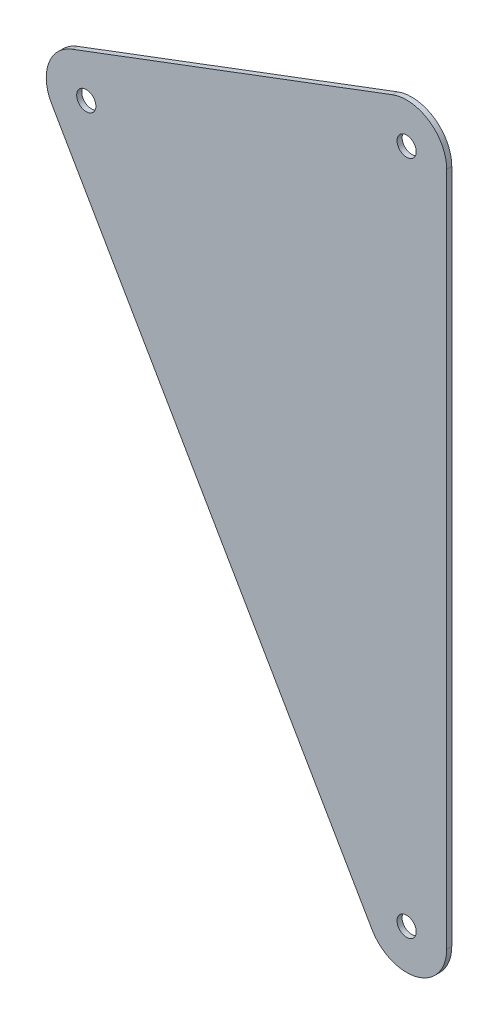
ISO-10303-21;
HEADER;
FILE_DESCRIPTION(('STEP AP214'),'2;1');
FILE_NAME('part.step','',(''),(''),'','','');
FILE_SCHEMA(('AUTOMOTIVE_DESIGN { 1 0 10303 214 1 1 1 1 }'));
ENDSEC;
DATA;
#1=APPLICATION_CONTEXT('core data for automotive mechanical design processes');
#2=APPLICATION_PROTOCOL_DEFINITION('international standard','automotive_design',2000,#1);
#3=PRODUCT_CONTEXT('',#1,'mechanical');
#4=PRODUCT('Part','Part','',(#3));
#5=PRODUCT_RELATED_PRODUCT_CATEGORY('part','',(#4));
#6=PRODUCT_DEFINITION_FORMATION('','',#4);
#7=PRODUCT_DEFINITION_CONTEXT('part definition',#1,'design');
#8=PRODUCT_DEFINITION('design','',#6,#7);
#9=PRODUCT_DEFINITION_SHAPE('','',#8);
#10=(LENGTH_UNIT() NAMED_UNIT(*) SI_UNIT(.MILLI.,.METRE.));
#11=(NAMED_UNIT(*) PLANE_ANGLE_UNIT() SI_UNIT($,.RADIAN.));
#12=(NAMED_UNIT(*) SI_UNIT($,.STERADIAN.) SOLID_ANGLE_UNIT());
#13=UNCERTAINTY_MEASURE_WITH_UNIT(LENGTH_MEASURE(1.E-05),#10,'distance_accuracy_value','');
#14=(GEOMETRIC_REPRESENTATION_CONTEXT(3) GLOBAL_UNCERTAINTY_ASSIGNED_CONTEXT((#13)) GLOBAL_UNIT_ASSIGNED_CONTEXT((#10,
#11,#12)) REPRESENTATION_CONTEXT('',''));
#15=CARTESIAN_POINT('',(0.,0.,0.));
#16=DIRECTION('',(0.,0.,1.));
#17=DIRECTION('',(1.,0.,0.));
#18=AXIS2_PLACEMENT_3D('',#15,#16,#17);
#19=CARTESIAN_POINT('',(0.,0.,1.5875));
#20=DIRECTION('',(0.,0.,1.));
#21=DIRECTION('',(1.,0.,0.));
#22=AXIS2_PLACEMENT_3D('',#19,#20,#21);
#23=PLANE('',#22);
#24=CARTESIAN_POINT('',(0.,210.889668604405,1.5875));
#25=DIRECTION('',(0.,0.,1.));
#26=DIRECTION('',(1.,0.,0.));
#27=AXIS2_PLACEMENT_3D('',#24,#25,#26);
#28=CIRCLE('',#27,3.);
#29=CARTESIAN_POINT('',(3.,210.889668604405,1.5875));
#30=VERTEX_POINT('',#29);
#31=EDGE_CURVE('E183',#30,#30,#28,.T.);
#32=ORIENTED_EDGE('',*,*,#31,.F.);
#33=EDGE_LOOP('',(#32));
#34=FACE_BOUND('',#33,.T.);
#35=CARTESIAN_POINT('',(0.,0.,1.5875));
#36=DIRECTION('',(0.,0.,1.));
#37=DIRECTION('',(1.,0.,0.));
#38=AXIS2_PLACEMENT_3D('',#35,#36,#37);
#39=CIRCLE('',#38,12.5);
#40=CARTESIAN_POINT('',(-10.8253175473055,-6.24999999999999,1.5875));
#41=VERTEX_POINT('',#40);
#42=CARTESIAN_POINT('',(12.5,0.,1.5875));
#43=VERTEX_POINT('',#42);
#44=EDGE_CURVE('E128',#41,#43,#39,.T.);
#45=ORIENTED_EDGE('',*,*,#44,.T.);
#46=DIRECTION('',(0.,1.,0.));
#47=VECTOR('',#46,1.);
#48=CARTESIAN_POINT('',(12.5,0.,1.5875));
#49=LINE('',#48,#47);
#50=CARTESIAN_POINT('',(12.5,210.889668604405,1.5875));
#51=VERTEX_POINT('',#50);
#52=EDGE_CURVE('E86',#43,#51,#49,.T.);
#53=ORIENTED_EDGE('',*,*,#52,.T.);
#54=CARTESIAN_POINT('',(0.,210.889668604405,1.5875));
#55=DIRECTION('',(0.,0.,1.));
#56=DIRECTION('',(1.,0.,0.));
#57=AXIS2_PLACEMENT_3D('',#54,#55,#56);
#58=CIRCLE('',#57,12.5);
#59=CARTESIAN_POINT('',(-4.40796658783525,222.586669526032,1.5875));
#60=VERTEX_POINT('',#59);
#61=EDGE_CURVE('E99',#51,#60,#58,.T.);
#62=ORIENTED_EDGE('',*,*,#61,.T.);
#63=DIRECTION('',(-0.935760073730109,-0.352637327026819,0.));
#64=VECTOR('',#63,1.);
#65=CARTESIAN_POINT('',(-4.40796658783525,222.586669526032,1.5875));
#66=LINE('',#65,#64);
#67=CARTESIAN_POINT('',(-104.407966587835,184.902081678514,1.5875));
#68=VERTEX_POINT('',#67);
#69=EDGE_CURVE('E93',#60,#68,#66,.T.);
#70=ORIENTED_EDGE('',*,*,#69,.T.);
#71=CARTESIAN_POINT('',(-100.,173.205080756888,1.5875));
#72=DIRECTION('',(0.,0.,1.));
#73=DIRECTION('',(1.,0.,0.));
#74=AXIS2_PLACEMENT_3D('',#71,#72,#73);
#75=CIRCLE('',#74,12.4999999999999);
#76=CARTESIAN_POINT('',(-110.825317547305,166.955080756888,1.5875));
#77=VERTEX_POINT('',#76);
#78=EDGE_CURVE('E97',#68,#77,#75,.T.);
#79=ORIENTED_EDGE('',*,*,#78,.T.);
#80=DIRECTION('',(0.5,-0.866025403784439,0.));
#81=VECTOR('',#80,1.);
#82=CARTESIAN_POINT('',(-110.825317547305,166.955080756888,1.5875));
#83=LINE('',#82,#81);
#84=EDGE_CURVE('E49',#77,#41,#83,.T.);
#85=ORIENTED_EDGE('',*,*,#84,.T.);
#86=EDGE_LOOP('',(#45,#53,#62,#70,#79,#85));
#87=FACE_BOUND('',#86,.T.);
#88=CARTESIAN_POINT('',(-100.,173.205080756888,1.5875));
#89=DIRECTION('',(0.,0.,1.));
#90=DIRECTION('',(1.,0.,0.));
#91=AXIS2_PLACEMENT_3D('',#88,#89,#90);
#92=CIRCLE('',#91,2.99999999999999);
#93=CARTESIAN_POINT('',(-97.,173.205080756888,1.5875));
#94=VERTEX_POINT('',#93);
#95=EDGE_CURVE('E121',#94,#94,#92,.T.);
#96=ORIENTED_EDGE('',*,*,#95,.F.);
#97=EDGE_LOOP('',(#96));
#98=FACE_BOUND('',#97,.T.);
#99=CARTESIAN_POINT('',(0.,0.,1.5875));
#100=DIRECTION('',(0.,0.,1.));
#101=DIRECTION('',(1.,0.,0.));
#102=AXIS2_PLACEMENT_3D('',#99,#100,#101);
#103=CIRCLE('',#102,3.);
#104=CARTESIAN_POINT('',(3.,0.,1.5875));
#105=VERTEX_POINT('',#104);
#106=EDGE_CURVE('E174',#105,#105,#103,.T.);
#107=ORIENTED_EDGE('',*,*,#106,.F.);
#108=EDGE_LOOP('',(#107));
#109=FACE_BOUND('',#108,.T.);
#110=ADVANCED_FACE('F32',(#34,#87,#98,#109),#23,.T.);
#111=CARTESIAN_POINT('',(0.,0.,0.));
#112=DIRECTION('',(0.,0.,1.));
#113=DIRECTION('',(1.,0.,0.));
#114=AXIS2_PLACEMENT_3D('',#111,#112,#113);
#115=PLANE('',#114);
#116=CARTESIAN_POINT('',(0.,0.,0.));
#117=DIRECTION('',(0.,0.,1.));
#118=DIRECTION('',(1.,0.,0.));
#119=AXIS2_PLACEMENT_3D('',#116,#117,#118);
#120=CIRCLE('',#119,12.5);
#121=CARTESIAN_POINT('',(-10.8253175473055,-6.24999999999999,0.));
#122=VERTEX_POINT('',#121);
#123=CARTESIAN_POINT('',(12.5,0.,0.));
#124=VERTEX_POINT('',#123);
#125=EDGE_CURVE('E117',#122,#124,#120,.T.);
#126=ORIENTED_EDGE('',*,*,#125,.F.);
#127=DIRECTION('',(0.5,-0.866025403784439,0.));
#128=VECTOR('',#127,1.);
#129=CARTESIAN_POINT('',(-110.825317547305,166.955080756888,0.));
#130=LINE('',#129,#128);
#131=CARTESIAN_POINT('',(-110.825317547305,166.955080756888,0.));
#132=VERTEX_POINT('',#131);
#133=EDGE_CURVE('E78',#132,#122,#130,.T.);
#134=ORIENTED_EDGE('',*,*,#133,.F.);
#135=CARTESIAN_POINT('',(-100.,173.205080756888,0.));
#136=DIRECTION('',(0.,0.,1.));
#137=DIRECTION('',(1.,0.,0.));
#138=AXIS2_PLACEMENT_3D('',#135,#136,#137);
#139=CIRCLE('',#138,12.4999999999999);
#140=CARTESIAN_POINT('',(-104.407966587835,184.902081678514,0.));
#141=VERTEX_POINT('',#140);
#142=EDGE_CURVE('E72',#141,#132,#139,.T.);
#143=ORIENTED_EDGE('',*,*,#142,.F.);
#144=DIRECTION('',(-0.935760073730109,-0.352637327026819,0.));
#145=VECTOR('',#144,1.);
#146=CARTESIAN_POINT('',(-4.40796658783525,222.586669526032,0.));
#147=LINE('',#146,#145);
#148=CARTESIAN_POINT('',(-4.40796658783525,222.586669526032,0.));
#149=VERTEX_POINT('',#148);
#150=EDGE_CURVE('E107',#149,#141,#147,.T.);
#151=ORIENTED_EDGE('',*,*,#150,.F.);
#152=CARTESIAN_POINT('',(0.,210.889668604405,0.));
#153=DIRECTION('',(0.,0.,1.));
#154=DIRECTION('',(1.,0.,0.));
#155=AXIS2_PLACEMENT_3D('',#152,#153,#154);
#156=CIRCLE('',#155,12.5);
#157=CARTESIAN_POINT('',(12.5,210.889668604405,0.));
#158=VERTEX_POINT('',#157);
#159=EDGE_CURVE('E123',#158,#149,#156,.T.);
#160=ORIENTED_EDGE('',*,*,#159,.F.);
#161=DIRECTION('',(0.,1.,0.));
#162=VECTOR('',#161,1.);
#163=CARTESIAN_POINT('',(12.5,0.,0.));
#164=LINE('',#163,#162);
#165=EDGE_CURVE('E120',#124,#158,#164,.T.);
#166=ORIENTED_EDGE('',*,*,#165,.F.);
#167=EDGE_LOOP('',(#126,#134,#143,#151,#160,#166));
#168=FACE_BOUND('',#167,.T.);
#169=CARTESIAN_POINT('',(-100.,173.205080756888,0.));
#170=DIRECTION('',(0.,0.,1.));
#171=DIRECTION('',(1.,0.,0.));
#172=AXIS2_PLACEMENT_3D('',#169,#170,#171);
#173=CIRCLE('',#172,2.99999999999999);
#174=CARTESIAN_POINT('',(-97.,173.205080756888,0.));
#175=VERTEX_POINT('',#174);
#176=EDGE_CURVE('E186',#175,#175,#173,.T.);
#177=ORIENTED_EDGE('',*,*,#176,.T.);
#178=EDGE_LOOP('',(#177));
#179=FACE_BOUND('',#178,.T.);
#180=CARTESIAN_POINT('',(0.,210.889668604405,0.));
#181=DIRECTION('',(0.,0.,1.));
#182=DIRECTION('',(1.,0.,0.));
#183=AXIS2_PLACEMENT_3D('',#180,#181,#182);
#184=CIRCLE('',#183,3.);
#185=CARTESIAN_POINT('',(3.,210.889668604405,0.));
#186=VERTEX_POINT('',#185);
#187=EDGE_CURVE('E180',#186,#186,#184,.T.);
#188=ORIENTED_EDGE('',*,*,#187,.T.);
#189=EDGE_LOOP('',(#188));
#190=FACE_BOUND('',#189,.T.);
#191=CARTESIAN_POINT('',(0.,0.,0.));
#192=DIRECTION('',(0.,0.,1.));
#193=DIRECTION('',(1.,0.,0.));
#194=AXIS2_PLACEMENT_3D('',#191,#192,#193);
#195=CIRCLE('',#194,3.);
#196=CARTESIAN_POINT('',(3.,0.,0.));
#197=VERTEX_POINT('',#196);
#198=EDGE_CURVE('E177',#197,#197,#195,.T.);
#199=ORIENTED_EDGE('',*,*,#198,.T.);
#200=EDGE_LOOP('',(#199));
#201=FACE_BOUND('',#200,.T.);
#202=ADVANCED_FACE('F137',(#168,#179,#190,#201),#115,.F.);
#203=CARTESIAN_POINT('',(0.,0.,1.5875));
#204=DIRECTION('',(0.,0.,-1.));
#205=DIRECTION('',(-1.,0.,0.));
#206=AXIS2_PLACEMENT_3D('',#203,#204,#205);
#207=CYLINDRICAL_SURFACE('',#206,12.5);
#208=ORIENTED_EDGE('',*,*,#125,.T.);
#209=DIRECTION('',(0.,0.,-1.));
#210=VECTOR('',#209,1.);
#211=CARTESIAN_POINT('',(12.5,0.,1.5875));
#212=LINE('',#211,#210);
#213=EDGE_CURVE('E11',#43,#124,#212,.T.);
#214=ORIENTED_EDGE('',*,*,#213,.F.);
#215=ORIENTED_EDGE('',*,*,#44,.F.);
#216=DIRECTION('',(0.,0.,-1.));
#217=VECTOR('',#216,1.);
#218=CARTESIAN_POINT('',(-10.8253175473055,-6.24999999999999,1.5875));
#219=LINE('',#218,#217);
#220=EDGE_CURVE('E113',#41,#122,#219,.T.);
#221=ORIENTED_EDGE('',*,*,#220,.T.);
#222=EDGE_LOOP('',(#208,#214,#215,#221));
#223=FACE_BOUND('',#222,.T.);
#224=ADVANCED_FACE('F34',(#223),#207,.T.);
#225=CARTESIAN_POINT('',(12.5,0.,1.5875));
#226=DIRECTION('',(-1.,0.,0.));
#227=DIRECTION('',(0.,-1.,0.));
#228=AXIS2_PLACEMENT_3D('',#225,#226,#227);
#229=PLANE('',#228);
#230=ORIENTED_EDGE('',*,*,#165,.T.);
#231=DIRECTION('',(0.,0.,-1.));
#232=VECTOR('',#231,1.);
#233=CARTESIAN_POINT('',(12.5,210.889668604405,1.5875));
#234=LINE('',#233,#232);
#235=EDGE_CURVE('E41',#51,#158,#234,.T.);
#236=ORIENTED_EDGE('',*,*,#235,.F.);
#237=ORIENTED_EDGE('',*,*,#52,.F.);
#238=ORIENTED_EDGE('',*,*,#213,.T.);
#239=EDGE_LOOP('',(#230,#236,#237,#238));
#240=FACE_BOUND('',#239,.T.);
#241=ADVANCED_FACE('F236',(#240),#229,.F.);
#242=CARTESIAN_POINT('',(0.,210.889668604405,1.5875));
#243=DIRECTION('',(0.,0.,-1.));
#244=DIRECTION('',(-1.,0.,0.));
#245=AXIS2_PLACEMENT_3D('',#242,#243,#244);
#246=CYLINDRICAL_SURFACE('',#245,12.5);
#247=ORIENTED_EDGE('',*,*,#159,.T.);
#248=DIRECTION('',(0.,0.,-1.));
#249=VECTOR('',#248,1.);
#250=CARTESIAN_POINT('',(-4.40796658783525,222.586669526032,1.5875));
#251=LINE('',#250,#249);
#252=EDGE_CURVE('E108',#60,#149,#251,.T.);
#253=ORIENTED_EDGE('',*,*,#252,.F.);
#254=ORIENTED_EDGE('',*,*,#61,.F.);
#255=ORIENTED_EDGE('',*,*,#235,.T.);
#256=EDGE_LOOP('',(#247,#253,#254,#255));
#257=FACE_BOUND('',#256,.T.);
#258=ADVANCED_FACE('F134',(#257),#246,.T.);
#259=CARTESIAN_POINT('',(-4.40796658783525,222.586669526032,1.5875));
#260=DIRECTION('',(0.352637327026819,-0.935760073730109,0.));
#261=DIRECTION('',(0.935760073730109,0.352637327026819,0.));
#262=AXIS2_PLACEMENT_3D('',#259,#260,#261);
#263=PLANE('',#262);
#264=ORIENTED_EDGE('',*,*,#150,.T.);
#265=DIRECTION('',(0.,0.,-1.));
#266=VECTOR('',#265,1.);
#267=CARTESIAN_POINT('',(-104.407966587835,184.902081678514,1.5875));
#268=LINE('',#267,#266);
#269=EDGE_CURVE('E104',#68,#141,#268,.T.);
#270=ORIENTED_EDGE('',*,*,#269,.F.);
#271=ORIENTED_EDGE('',*,*,#69,.F.);
#272=ORIENTED_EDGE('',*,*,#252,.T.);
#273=EDGE_LOOP('',(#264,#270,#271,#272));
#274=FACE_BOUND('',#273,.T.);
#275=ADVANCED_FACE('F105',(#274),#263,.F.);
#276=CARTESIAN_POINT('',(-100.,173.205080756888,1.5875));
#277=DIRECTION('',(0.,0.,-1.));
#278=DIRECTION('',(-1.,0.,0.));
#279=AXIS2_PLACEMENT_3D('',#276,#277,#278);
#280=CYLINDRICAL_SURFACE('',#279,12.4999999999999);
#281=ORIENTED_EDGE('',*,*,#142,.T.);
#282=DIRECTION('',(0.,0.,-1.));
#283=VECTOR('',#282,1.);
#284=CARTESIAN_POINT('',(-110.825317547305,166.955080756888,1.5875));
#285=LINE('',#284,#283);
#286=EDGE_CURVE('E109',#77,#132,#285,.T.);
#287=ORIENTED_EDGE('',*,*,#286,.F.);
#288=ORIENTED_EDGE('',*,*,#78,.F.);
#289=ORIENTED_EDGE('',*,*,#269,.T.);
#290=EDGE_LOOP('',(#281,#287,#288,#289));
#291=FACE_BOUND('',#290,.T.);
#292=ADVANCED_FACE('F111',(#291),#280,.T.);
#293=CARTESIAN_POINT('',(-110.825317547305,166.955080756888,1.5875));
#294=DIRECTION('',(0.866025403784439,0.5,0.));
#295=DIRECTION('',(-0.5,0.866025403784439,0.));
#296=AXIS2_PLACEMENT_3D('',#293,#294,#295);
#297=PLANE('',#296);
#298=ORIENTED_EDGE('',*,*,#133,.T.);
#299=ORIENTED_EDGE('',*,*,#220,.F.);
#300=ORIENTED_EDGE('',*,*,#84,.F.);
#301=ORIENTED_EDGE('',*,*,#286,.T.);
#302=EDGE_LOOP('',(#298,#299,#300,#301));
#303=FACE_BOUND('',#302,.T.);
#304=ADVANCED_FACE('F142',(#303),#297,.F.);
#305=CARTESIAN_POINT('',(-100.,173.205080756888,1.5875));
#306=DIRECTION('',(0.,0.,-1.));
#307=DIRECTION('',(-1.,0.,0.));
#308=AXIS2_PLACEMENT_3D('',#305,#306,#307);
#309=CYLINDRICAL_SURFACE('',#308,2.99999999999999);
#310=ORIENTED_EDGE('',*,*,#95,.T.);
#311=EDGE_LOOP('',(#310));
#312=FACE_BOUND('',#311,.T.);
#313=ORIENTED_EDGE('',*,*,#176,.F.);
#314=EDGE_LOOP('',(#313));
#315=FACE_BOUND('',#314,.T.);
#316=ADVANCED_FACE('F144',(#312,#315),#309,.F.);
#317=CARTESIAN_POINT('',(0.,210.889668604405,1.5875));
#318=DIRECTION('',(0.,0.,-1.));
#319=DIRECTION('',(-1.,0.,0.));
#320=AXIS2_PLACEMENT_3D('',#317,#318,#319);
#321=CYLINDRICAL_SURFACE('',#320,3.);
#322=ORIENTED_EDGE('',*,*,#31,.T.);
#323=EDGE_LOOP('',(#322));
#324=FACE_BOUND('',#323,.T.);
#325=ORIENTED_EDGE('',*,*,#187,.F.);
#326=EDGE_LOOP('',(#325));
#327=FACE_BOUND('',#326,.T.);
#328=ADVANCED_FACE('F150',(#324,#327),#321,.F.);
#329=CARTESIAN_POINT('',(0.,0.,1.5875));
#330=DIRECTION('',(0.,0.,-1.));
#331=DIRECTION('',(-1.,0.,0.));
#332=AXIS2_PLACEMENT_3D('',#329,#330,#331);
#333=CYLINDRICAL_SURFACE('',#332,3.);
#334=ORIENTED_EDGE('',*,*,#106,.T.);
#335=EDGE_LOOP('',(#334));
#336=FACE_BOUND('',#335,.T.);
#337=ORIENTED_EDGE('',*,*,#198,.F.);
#338=EDGE_LOOP('',(#337));
#339=FACE_BOUND('',#338,.T.);
#340=ADVANCED_FACE('F165',(#336,#339),#333,.F.);
#341=CLOSED_SHELL('',(#110,#202,#224,#241,#258,#275,#292,#304,#316,#328,#340));
#342=MANIFOLD_SOLID_BREP('B2',#341);
#343=ADVANCED_BREP_SHAPE_REPRESENTATION('',(#18,#342),#14);
#344=SHAPE_DEFINITION_REPRESENTATION(#9,#343);
ENDSEC;
END-ISO-10303-21;
